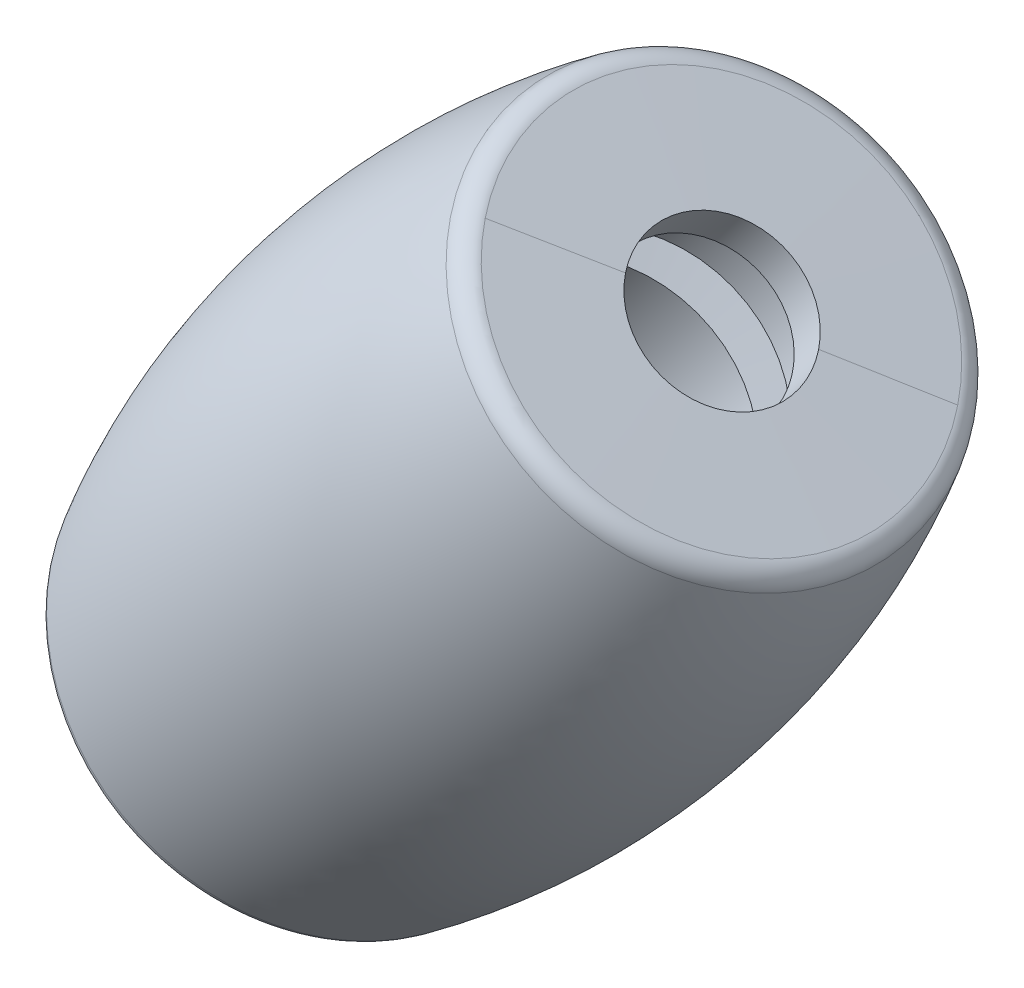
ISO-10303-21;
HEADER;
FILE_DESCRIPTION(('STEP AP214'),'2;1');
FILE_NAME('part.step','',(''),(''),'','','');
FILE_SCHEMA(('AUTOMOTIVE_DESIGN { 1 0 10303 214 1 1 1 1 }'));
ENDSEC;
DATA;
#1=APPLICATION_CONTEXT('core data for automotive mechanical design processes');
#2=APPLICATION_PROTOCOL_DEFINITION('international standard','automotive_design',2000,#1);
#3=PRODUCT_CONTEXT('',#1,'mechanical');
#4=PRODUCT('Part','Part','',(#3));
#5=PRODUCT_RELATED_PRODUCT_CATEGORY('part','',(#4));
#6=PRODUCT_DEFINITION_FORMATION('','',#4);
#7=PRODUCT_DEFINITION_CONTEXT('part definition',#1,'design');
#8=PRODUCT_DEFINITION('design','',#6,#7);
#9=PRODUCT_DEFINITION_SHAPE('','',#8);
#10=(LENGTH_UNIT() NAMED_UNIT(*) SI_UNIT(.MILLI.,.METRE.));
#11=(NAMED_UNIT(*) PLANE_ANGLE_UNIT() SI_UNIT($,.RADIAN.));
#12=(NAMED_UNIT(*) SI_UNIT($,.STERADIAN.) SOLID_ANGLE_UNIT());
#13=UNCERTAINTY_MEASURE_WITH_UNIT(LENGTH_MEASURE(1.E-05),#10,'distance_accuracy_value','');
#14=(GEOMETRIC_REPRESENTATION_CONTEXT(3) GLOBAL_UNCERTAINTY_ASSIGNED_CONTEXT((#13)) GLOBAL_UNIT_ASSIGNED_CONTEXT((#10,
#11,#12)) REPRESENTATION_CONTEXT('',''));
#15=CARTESIAN_POINT('',(0.,0.,0.));
#16=DIRECTION('',(0.,0.,1.));
#17=DIRECTION('',(1.,0.,0.));
#18=AXIS2_PLACEMENT_3D('',#15,#16,#17);
#19=CARTESIAN_POINT('',(-18.4522106782593,15.3546709858989,0.));
#20=DIRECTION('',(-0.623489801858733,-0.78183148246803,0.));
#21=DIRECTION('',(0.78183148246803,-0.623489801858733,0.));
#22=AXIS2_PLACEMENT_3D('',#19,#20,#21);
#23=CONICAL_SURFACE('',#22,4.5000000001542,1.4835298641937);
#24=CARTESIAN_POINT('',(-18.4522106783033,15.3546709858436,0.));
#25=DIRECTION('',(0.623489801858733,0.78183148246803,0.));
#26=DIRECTION('',(-0.78183148246803,0.623489801858733,0.));
#27=AXIS2_PLACEMENT_3D('',#24,#25,#26);
#28=CIRCLE('',#27,4.5);
#29=CARTESIAN_POINT('',(-21.9704523494095,18.1603750942079,0.));
#30=VERTEX_POINT('',#29);
#31=EDGE_CURVE('E21',#30,#30,#28,.F.);
#32=ORIENTED_EDGE('',*,*,#31,.T.);
#33=EDGE_LOOP('',(#32));
#34=FACE_BOUND('',#33,.T.);
#35=CARTESIAN_POINT('',(-18.3703882440733,15.457273073099,0.));
#36=DIRECTION('',(0.623489801858733,0.78183148246803,0.));
#37=DIRECTION('',(-0.78183148246803,0.623489801858733,0.));
#38=AXIS2_PLACEMENT_3D('',#35,#36,#37);
#39=CIRCLE('',#38,3.);
#40=CARTESIAN_POINT('',(-20.7158826914774,17.3277424786752,0.));
#41=VERTEX_POINT('',#40);
#42=EDGE_CURVE('E101',#41,#41,#39,.T.);
#43=ORIENTED_EDGE('',*,*,#42,.T.);
#44=EDGE_LOOP('',(#43));
#45=FACE_BOUND('',#44,.T.);
#46=ADVANCED_FACE('F17',(#34,#45),#23,.F.);
#47=CARTESIAN_POINT('',(-18.7639555792327,14.9637552446096,0.));
#48=DIRECTION('',(0.623489801858733,0.78183148246803,0.));
#49=DIRECTION('',(-0.78183148246803,0.623489801858733,0.));
#50=AXIS2_PLACEMENT_3D('',#47,#48,#49);
#51=CYLINDRICAL_SURFACE('',#50,4.5);
#52=CARTESIAN_POINT('',(-19.075700480154,14.5728395033857,0.));
#53=DIRECTION('',(0.623489801858733,0.78183148246803,0.));
#54=DIRECTION('',(0.585160399242417,-0.466649846623631,-0.663193205487358));
#55=AXIS2_PLACEMENT_3D('',#52,#53,#54);
#56=CIRCLE('',#55,4.49999999995989);
#57=CARTESIAN_POINT('',(-16.4424786835866,12.4729151935981,-2.98436942466651));
#58=VERTEX_POINT('',#57);
#59=EDGE_CURVE('E99',#58,#58,#56,.F.);
#60=ORIENTED_EDGE('',*,*,#59,.T.);
#61=EDGE_LOOP('',(#60));
#62=FACE_BOUND('',#61,.T.);
#63=ORIENTED_EDGE('',*,*,#31,.F.);
#64=EDGE_LOOP('',(#63));
#65=FACE_BOUND('',#64,.T.);
#66=ADVANCED_FACE('F109',(#62,#65),#51,.F.);
#67=CARTESIAN_POINT('',(-17.4858014854223,16.5665097836691,0.));
#68=DIRECTION('',(0.623489801858733,0.78183148246803,0.));
#69=DIRECTION('',(-0.78183148246803,0.623489801858733,0.));
#70=AXIS2_PLACEMENT_3D('',#67,#68,#69);
#71=CYLINDRICAL_SURFACE('',#70,3.);
#72=ORIENTED_EDGE('',*,*,#42,.F.);
#73=EDGE_LOOP('',(#72));
#74=FACE_BOUND('',#73,.T.);
#75=CARTESIAN_POINT('',(-16.6012147267927,17.6757464942122,0.));
#76=DIRECTION('',(0.623489801858733,0.78183148246803,0.));
#77=DIRECTION('',(0.58516039925179,-0.466649846631107,-0.663193205473827));
#78=AXIS2_PLACEMENT_3D('',#75,#76,#77);
#79=CIRCLE('',#78,3.00000000006303);
#80=CARTESIAN_POINT('',(-14.8457335290004,16.2757969542895,-1.98957961646329));
#81=VERTEX_POINT('',#80);
#82=EDGE_CURVE('E96',#81,#81,#79,.T.);
#83=ORIENTED_EDGE('',*,*,#82,.T.);
#84=EDGE_LOOP('',(#83));
#85=FACE_BOUND('',#84,.T.);
#86=ADVANCED_FACE('F111',(#74,#85),#71,.F.);
#87=CARTESIAN_POINT('',(-19.0757004801596,14.5728395033786,0.));
#88=DIRECTION('',(0.623489801858733,0.78183148246803,0.));
#89=DIRECTION('',(-0.78183148246803,0.623489801858733,0.));
#90=AXIS2_PLACEMENT_3D('',#87,#88,#89);
#91=CONICAL_SURFACE('',#90,4.50000000005737,1.48352986422129);
#92=ORIENTED_EDGE('',*,*,#59,.F.);
#93=EDGE_LOOP('',(#92));
#94=FACE_BOUND('',#93,.T.);
#95=CARTESIAN_POINT('',(-19.1575229143921,14.4702374161202,0.));
#96=DIRECTION('',(0.623489801858733,0.78183148246803,0.));
#97=DIRECTION('',(-0.78183148246803,0.623489801858733,0.));
#98=AXIS2_PLACEMENT_3D('',#95,#96,#97);
#99=CIRCLE('',#98,3.);
#100=CARTESIAN_POINT('',(-21.5030173617962,16.3407068216964,0.));
#101=VERTEX_POINT('',#100);
#102=EDGE_CURVE('E93',#101,#101,#99,.F.);
#103=ORIENTED_EDGE('',*,*,#102,.T.);
#104=EDGE_LOOP('',(#103));
#105=FACE_BOUND('',#104,.T.);
#106=ADVANCED_FACE('F119',(#94,#105),#91,.F.);
#107=CARTESIAN_POINT('',(-16.5193922925809,17.7783485814447,0.));
#108=DIRECTION('',(0.623489801858733,0.78183148246803,0.));
#109=DIRECTION('',(-0.78183148246803,0.623489801858733,0.));
#110=AXIS2_PLACEMENT_3D('',#107,#108,#109);
#111=CONICAL_SURFACE('',#110,4.49999999997896,1.48352986421136);
#112=CARTESIAN_POINT('',(-16.5193922925413,17.7783485814945,0.));
#113=DIRECTION('',(0.623489801858733,0.78183148246803,0.));
#114=DIRECTION('',(-0.78183148246803,0.623489801858733,0.));
#115=AXIS2_PLACEMENT_3D('',#112,#113,#114);
#116=CIRCLE('',#115,4.5);
#117=CARTESIAN_POINT('',(-20.0376339636474,20.5840526898588,0.));
#118=VERTEX_POINT('',#117);
#119=EDGE_CURVE('E77',#118,#118,#116,.T.);
#120=ORIENTED_EDGE('',*,*,#119,.T.);
#121=EDGE_LOOP('',(#120));
#122=FACE_BOUND('',#121,.T.);
#123=ORIENTED_EDGE('',*,*,#82,.F.);
#124=EDGE_LOOP('',(#123));
#125=FACE_BOUND('',#124,.T.);
#126=ADVANCED_FACE('F231',(#122,#125),#111,.F.);
#127=CARTESIAN_POINT('',(-20.0421096730431,13.3610007055501,0.));
#128=DIRECTION('',(0.623489801858733,0.78183148246803,0.));
#129=DIRECTION('',(-0.78183148246803,0.623489801858733,0.));
#130=AXIS2_PLACEMENT_3D('',#127,#128,#129);
#131=CYLINDRICAL_SURFACE('',#130,3.);
#132=ORIENTED_EDGE('',*,*,#102,.F.);
#133=EDGE_LOOP('',(#132));
#134=FACE_BOUND('',#133,.T.);
#135=CARTESIAN_POINT('',(-20.9266964317206,12.251763994947,0.));
#136=DIRECTION('',(-0.623489801858733,-0.78183148246803,0.));
#137=DIRECTION('',(-0.585160399236117,0.466649846618608,0.66319320549645));
#138=AXIS2_PLACEMENT_3D('',#135,#136,#137);
#139=CIRCLE('',#138,2.9999999999607);
#140=CARTESIAN_POINT('',(-19.1712152339766,10.8518144550893,-1.98957961642698));
#141=VERTEX_POINT('',#140);
#142=CARTESIAN_POINT('',(-22.6821776295252,13.6517135348805,1.98957961657116));
#143=VERTEX_POINT('',#142);
#144=EDGE_CURVE('E70',#141,#143,#139,.T.);
#145=ORIENTED_EDGE('',*,*,#144,.T.);
#146=CARTESIAN_POINT('',(-20.9266964317206,12.251763994947,0.));
#147=DIRECTION('',(-0.623489801858733,-0.78183148246803,0.));
#148=DIRECTION('',(-0.585160399236117,0.466649846618608,0.66319320549645));
#149=AXIS2_PLACEMENT_3D('',#146,#147,#148);
#150=CIRCLE('',#149,2.9999999999607);
#151=EDGE_CURVE('E68',#143,#141,#150,.T.);
#152=ORIENTED_EDGE('',*,*,#151,.T.);
#153=EDGE_LOOP('',(#145,#152));
#154=FACE_BOUND('',#153,.T.);
#155=ADVANCED_FACE('F71',(#134,#154),#131,.F.);
#156=CARTESIAN_POINT('',(-16.2076473916119,18.1692643227285,0.));
#157=DIRECTION('',(0.623489801858733,0.78183148246803,0.));
#158=DIRECTION('',(-0.78183148246803,0.623489801858733,0.));
#159=AXIS2_PLACEMENT_3D('',#156,#157,#158);
#160=CYLINDRICAL_SURFACE('',#159,4.5);
#161=CARTESIAN_POINT('',(-15.8959024906918,18.5601800639509,0.));
#162=DIRECTION('',(-0.623489801858733,-0.78183148246803,0.));
#163=DIRECTION('',(-0.585160399250354,0.466649846629961,0.663193205475901));
#164=AXIS2_PLACEMENT_3D('',#161,#162,#163);
#165=CIRCLE('',#164,4.50000000003765);
#166=CARTESIAN_POINT('',(-18.5291242873404,20.6601043738033,2.98436942466651));
#167=VERTEX_POINT('',#166);
#168=EDGE_CURVE('E210',#167,#167,#165,.F.);
#169=ORIENTED_EDGE('',*,*,#168,.T.);
#170=EDGE_LOOP('',(#169));
#171=FACE_BOUND('',#170,.T.);
#172=ORIENTED_EDGE('',*,*,#119,.F.);
#173=EDGE_LOOP('',(#172));
#174=FACE_BOUND('',#173,.T.);
#175=ADVANCED_FACE('F225',(#171,#174),#160,.F.);
#176=CARTESIAN_POINT('',(-21.0085188659488,12.1491619076938,0.));
#177=DIRECTION('',(-0.623489801858733,-0.78183148246803,0.));
#178=DIRECTION('',(0.78183148246803,-0.623489801858733,0.));
#179=AXIS2_PLACEMENT_3D('',#176,#177,#178);
#180=CONICAL_SURFACE('',#179,4.50000000000739,1.48352986418043);
#181=CARTESIAN_POINT('',(-19.1712152340011,10.8518144550822,-1.98957961641394));
#182=CARTESIAN_POINT('',(-19.1380519771208,10.8183737526768,-2.03102919177293));
#183=CARTESIAN_POINT('',(-19.1048887202494,10.7849330502782,-2.07247876714446));
#184=CARTESIAN_POINT('',(-19.0385622065336,10.7180516455136,-2.15537791784968));
#185=CARTESIAN_POINT('',(-19.0053989496892,10.6846109431476,-2.19682749318337));
#186=CARTESIAN_POINT('',(-18.939072435966,10.617729538397,-2.27972664383784));
#187=CARTESIAN_POINT('',(-18.9059091790873,10.5842888360123,-2.32117621915863));
#188=CARTESIAN_POINT('',(-18.8395826653652,10.5174074312614,-2.40407536981368));
#189=CARTESIAN_POINT('',(-18.8064194085218,10.4839667288952,-2.44552494514795));
#190=CARTESIAN_POINT('',(-18.7400928948034,10.4170853241319,-2.52842409585208));
#191=CARTESIAN_POINT('',(-18.7069296379285,10.3836446217347,-2.56987367122195));
#192=CARTESIAN_POINT('',(-18.6406031242022,10.3167632169442,-2.65277282191615));
#193=CARTESIAN_POINT('',(-18.6074398673509,10.2833225145508,-2.69422239724048));
#194=CARTESIAN_POINT('',(-18.5411133536507,10.2164411097942,-2.77712154789709));
#195=CARTESIAN_POINT('',(-18.5079500968018,10.183000407431,-2.81857112322938));
#196=CARTESIAN_POINT('',(-18.4416235830771,10.1161190026719,-2.90147027393191));
#197=CARTESIAN_POINT('',(-18.4084603262014,10.0826783002759,-2.94291984930215));
#198=CARTESIAN_POINT('',(-18.3752970693307,10.0492375978657,-2.98436942466491));
#199=B_SPLINE_CURVE_WITH_KNOTS('',3,(#181,#182,#183,#184,#185,#186,#187,#188,#189,#190,#191,
#192,#193,#194,#195,#196,#197,#198),.UNSPECIFIED.,.F.,.F.,(4,2,2,2,2,2,2,2,4),(0.,
0.188216219639607,0.3764324391091,0.564648658637371,0.752864878106864,0.941081097746466,
1.12929731725219,1.31751353672168,1.50572975636128),.UNSPECIFIED.);
#200=CARTESIAN_POINT('',(-18.3752970693256,10.0492375978743,-2.98436942466369));
#201=VERTEX_POINT('',#200);
#202=EDGE_CURVE('E84',#141,#201,#199,.T.);
#203=ORIENTED_EDGE('',*,*,#202,.T.);
#204=CARTESIAN_POINT('',(-21.0085188659241,12.1491619077247,0.));
#205=DIRECTION('',(0.623489801858733,0.78183148246803,0.));
#206=DIRECTION('',(-0.78183148246803,0.623489801858733,0.));
#207=AXIS2_PLACEMENT_3D('',#204,#205,#206);
#208=CIRCLE('',#207,4.5);
#209=CARTESIAN_POINT('',(-23.6417406625634,14.2490862175312,2.98436942473594));
#210=VERTEX_POINT('',#209);
#211=EDGE_CURVE('E87',#201,#210,#208,.F.);
#212=ORIENTED_EDGE('',*,*,#211,.T.);
#213=DIRECTION('',(0.637274404039492,-0.396732999518862,-0.660669555109721));
#214=VECTOR('',#213,1.);
#215=CARTESIAN_POINT('',(-481350.537000196,299662.660657417,499000.));
#216=LINE('',#215,#214);
#217=EDGE_CURVE('E76',#210,#143,#216,.T.);
#218=ORIENTED_EDGE('',*,*,#217,.T.);
#219=ORIENTED_EDGE('',*,*,#144,.F.);
#220=EDGE_LOOP('',(#203,#212,#218,#219));
#221=FACE_BOUND('',#220,.T.);
#222=ADVANCED_FACE('F86',(#221),#180,.F.);
#223=CARTESIAN_POINT('',(-21.0085188659376,12.1491619077078,0.));
#224=DIRECTION('',(-0.623489801858733,-0.78183148246803,0.));
#225=DIRECTION('',(0.78183148246803,-0.623489801858733,0.));
#226=AXIS2_PLACEMENT_3D('',#223,#224,#225);
#227=CONICAL_SURFACE('',#226,4.50000000020236,1.48352986420362);
#228=ORIENTED_EDGE('',*,*,#151,.F.);
#229=ORIENTED_EDGE('',*,*,#217,.F.);
#230=CARTESIAN_POINT('',(-21.0085188659241,12.1491619077247,0.));
#231=DIRECTION('',(0.623489801858733,0.78183148246803,0.));
#232=DIRECTION('',(-0.78183148246803,0.623489801858733,0.));
#233=AXIS2_PLACEMENT_3D('',#230,#231,#232);
#234=CIRCLE('',#233,4.5);
#235=EDGE_CURVE('E207',#210,#201,#234,.F.);
#236=ORIENTED_EDGE('',*,*,#235,.T.);
#237=ORIENTED_EDGE('',*,*,#202,.F.);
#238=EDGE_LOOP('',(#228,#229,#236,#237));
#239=FACE_BOUND('',#238,.T.);
#240=ADVANCED_FACE('F81',(#239),#227,.F.);
#241=CARTESIAN_POINT('',(-15.8959024906862,18.5601800639579,0.));
#242=DIRECTION('',(-0.623489801858733,-0.78183148246803,0.));
#243=DIRECTION('',(0.78183148246803,-0.623489801858733,0.));
#244=AXIS2_PLACEMENT_3D('',#241,#242,#243);
#245=CONICAL_SURFACE('',#244,4.50000000013513,1.48352986420362);
#246=ORIENTED_EDGE('',*,*,#168,.F.);
#247=EDGE_LOOP('',(#246));
#248=FACE_BOUND('',#247,.T.);
#249=CARTESIAN_POINT('',(-15.8140800564525,18.662782151218,0.));
#250=DIRECTION('',(0.623489801858733,0.78183148246803,0.));
#251=DIRECTION('',(-0.78183148246803,0.623489801858733,0.));
#252=AXIS2_PLACEMENT_3D('',#249,#250,#251);
#253=CIRCLE('',#252,3.);
#254=CARTESIAN_POINT('',(-18.1595745038566,20.5332515567942,0.));
#255=VERTEX_POINT('',#254);
#256=EDGE_CURVE('E204',#255,#255,#253,.T.);
#257=ORIENTED_EDGE('',*,*,#256,.T.);
#258=EDGE_LOOP('',(#257));
#259=FACE_BOUND('',#258,.T.);
#260=ADVANCED_FACE('F219',(#248,#259),#245,.F.);
#261=CARTESIAN_POINT('',(-21.3202637668535,11.7582461664907,0.));
#262=DIRECTION('',(0.623489801858733,0.78183148246803,0.));
#263=DIRECTION('',(-0.78183148246803,0.623489801858733,0.));
#264=AXIS2_PLACEMENT_3D('',#261,#262,#263);
#265=CYLINDRICAL_SURFACE('',#264,4.5);
#266=CARTESIAN_POINT('',(-21.6320086677604,11.3673304252848,0.));
#267=DIRECTION('',(0.623489801858733,0.78183148246803,0.));
#268=DIRECTION('',(0.585160399249281,-0.466649846629105,-0.66319320547745));
#269=AXIS2_PLACEMENT_3D('',#266,#267,#268);
#270=CIRCLE('',#269,4.50000000002713);
#271=CARTESIAN_POINT('',(-18.9987868711228,9.26740611544119,-2.98436942466651));
#272=VERTEX_POINT('',#271);
#273=EDGE_CURVE('E201',#272,#272,#270,.F.);
#274=ORIENTED_EDGE('',*,*,#273,.T.);
#275=EDGE_LOOP('',(#274));
#276=FACE_BOUND('',#275,.T.);
#277=ORIENTED_EDGE('',*,*,#211,.F.);
#278=ORIENTED_EDGE('',*,*,#235,.F.);
#279=EDGE_LOOP('',(#277,#278));
#280=FACE_BOUND('',#279,.T.);
#281=ADVANCED_FACE('F273',(#276,#280),#265,.F.);
#282=CARTESIAN_POINT('',(-15.3637952100659,19.2274214892373,0.));
#283=DIRECTION('',(0.623489801858733,0.78183148246803,0.));
#284=DIRECTION('',(-0.78183148246803,0.623489801858733,0.));
#285=AXIS2_PLACEMENT_3D('',#282,#283,#284);
#286=CYLINDRICAL_SURFACE('',#285,3.);
#287=ORIENTED_EDGE('',*,*,#256,.F.);
#288=EDGE_LOOP('',(#287));
#289=FACE_BOUND('',#288,.T.);
#290=CARTESIAN_POINT('',(-14.9135103637034,19.7920608272265,0.));
#291=DIRECTION('',(0.623489801858733,0.78183148246803,0.));
#292=DIRECTION('',(0.585160399247144,-0.466649846627402,-0.663193205480534));
#293=AXIS2_PLACEMENT_3D('',#290,#291,#292);
#294=CIRCLE('',#293,2.99999999994697);
#295=CARTESIAN_POINT('',(-13.158029165993,18.3921112873691,-1.98957961640644));
#296=VERTEX_POINT('',#295);
#297=EDGE_CURVE('E198',#296,#296,#294,.T.);
#298=ORIENTED_EDGE('',*,*,#297,.T.);
#299=EDGE_LOOP('',(#298));
#300=FACE_BOUND('',#299,.T.);
#301=ADVANCED_FACE('F280',(#289,#300),#286,.F.);
#302=CARTESIAN_POINT('',(-21.632008667766,11.3673304252778,0.));
#303=DIRECTION('',(0.623489801858733,0.78183148246803,0.));
#304=DIRECTION('',(-0.78183148246803,0.623489801858733,0.));
#305=AXIS2_PLACEMENT_3D('',#302,#303,#304);
#306=CONICAL_SURFACE('',#305,4.50000000012462,1.48352986420362);
#307=ORIENTED_EDGE('',*,*,#273,.F.);
#308=EDGE_LOOP('',(#307));
#309=FACE_BOUND('',#308,.T.);
#310=CARTESIAN_POINT('',(-21.7138311020129,11.2647283380012,0.));
#311=DIRECTION('',(0.623489801858733,0.78183148246803,0.));
#312=DIRECTION('',(-0.78183148246803,0.623489801858733,0.));
#313=AXIS2_PLACEMENT_3D('',#310,#311,#312);
#314=CIRCLE('',#313,3.);
#315=CARTESIAN_POINT('',(-24.059325549417,13.1351977435774,0.));
#316=VERTEX_POINT('',#315);
#317=EDGE_CURVE('E195',#316,#316,#314,.F.);
#318=ORIENTED_EDGE('',*,*,#317,.T.);
#319=EDGE_LOOP('',(#318));
#320=FACE_BOUND('',#319,.T.);
#321=ADVANCED_FACE('F287',(#309,#320),#306,.F.);
#322=CARTESIAN_POINT('',(-14.8671443176208,19.8502020100283,0.));
#323=DIRECTION('',(0.623489801858733,0.78183148246803,0.));
#324=DIRECTION('',(-0.78183148246803,0.623489801858733,0.));
#325=AXIS2_PLACEMENT_3D('',#322,#323,#324);
#326=CONICAL_SURFACE('',#325,3.85000000049085,1.48352986426301);
#327=CARTESIAN_POINT('',(-14.8671443176156,19.8502020100348,0.));
#328=DIRECTION('',(0.623489801858733,0.78183148246803,0.));
#329=DIRECTION('',(-0.78183148246803,0.623489801858733,0.));
#330=AXIS2_PLACEMENT_3D('',#327,#328,#329);
#331=CIRCLE('',#330,3.85);
#332=CARTESIAN_POINT('',(-17.8771955251175,22.2506377471909,0.));
#333=VERTEX_POINT('',#332);
#334=EDGE_CURVE('E192',#333,#333,#331,.T.);
#335=ORIENTED_EDGE('',*,*,#334,.T.);
#336=EDGE_LOOP('',(#335));
#337=FACE_BOUND('',#336,.T.);
#338=ORIENTED_EDGE('',*,*,#297,.F.);
#339=EDGE_LOOP('',(#338));
#340=FACE_BOUND('',#339,.T.);
#341=ADVANCED_FACE('F295',(#337,#340),#326,.F.);
#342=CARTESIAN_POINT('',(-22.1641159483995,10.7000889999819,0.));
#343=DIRECTION('',(0.623489801858733,0.78183148246803,0.));
#344=DIRECTION('',(-0.78183148246803,0.623489801858733,0.));
#345=AXIS2_PLACEMENT_3D('',#342,#343,#344);
#346=CYLINDRICAL_SURFACE('',#345,3.);
#347=ORIENTED_EDGE('',*,*,#317,.F.);
#348=EDGE_LOOP('',(#347));
#349=FACE_BOUND('',#348,.T.);
#350=CARTESIAN_POINT('',(-22.6144007947987,10.1354496619467,0.));
#351=DIRECTION('',(-0.623489801858733,-0.78183148246803,0.));
#352=DIRECTION('',(-0.585160399249785,0.466649846629508,0.663193205476722));
#353=AXIS2_PLACEMENT_3D('',#350,#351,#352);
#354=CIRCLE('',#353,2.99999999996422);
#355=CARTESIAN_POINT('',(-24.3698819925271,11.5353992018186,1.98957961640645));
#356=VERTEX_POINT('',#355);
#357=EDGE_CURVE('E189',#356,#356,#354,.T.);
#358=ORIENTED_EDGE('',*,*,#357,.T.);
#359=EDGE_LOOP('',(#358));
#360=FACE_BOUND('',#359,.T.);
#361=ADVANCED_FACE('F303',(#349,#360),#346,.F.);
#362=CARTESIAN_POINT('',(-14.5779240808966,20.2128727157299,0.));
#363=DIRECTION('',(0.623489801858733,0.78183148246803,0.));
#364=DIRECTION('',(-0.78183148246803,0.623489801858733,0.));
#365=AXIS2_PLACEMENT_3D('',#362,#363,#364);
#366=CYLINDRICAL_SURFACE('',#365,3.85);
#367=CARTESIAN_POINT('',(-14.288703844157,20.5755434214507,0.));
#368=DIRECTION('',(-0.623489801858733,-0.78183148246803,0.));
#369=DIRECTION('',(-0.585160399244819,0.466649846625547,0.663193205483891));
#370=AXIS2_PLACEMENT_3D('',#367,#368,#369);
#371=CIRCLE('',#370,3.85000000000679);
#372=CARTESIAN_POINT('',(-16.5415713812536,22.3721453309622,2.55329384111747));
#373=VERTEX_POINT('',#372);
#374=EDGE_CURVE('E186',#373,#373,#371,.F.);
#375=ORIENTED_EDGE('',*,*,#374,.T.);
#376=EDGE_LOOP('',(#375));
#377=FACE_BOUND('',#376,.T.);
#378=ORIENTED_EDGE('',*,*,#334,.F.);
#379=EDGE_LOOP('',(#378));
#380=FACE_BOUND('',#379,.T.);
#381=ADVANCED_FACE('F311',(#377,#380),#366,.F.);
#382=CARTESIAN_POINT('',(-22.6607668408539,10.0773084791792,0.));
#383=DIRECTION('',(-0.623489801858733,-0.78183148246803,0.));
#384=DIRECTION('',(0.78183148246803,-0.623489801858733,0.));
#385=AXIS2_PLACEMENT_3D('',#382,#383,#384);
#386=CONICAL_SURFACE('',#385,3.85000000003602,1.48352986421828);
#387=CARTESIAN_POINT('',(-22.6607668408498,10.0773084791844,0.));
#388=DIRECTION('',(0.623489801858733,0.78183148246803,0.));
#389=DIRECTION('',(-0.78183148246803,0.623489801858733,0.));
#390=AXIS2_PLACEMENT_3D('',#387,#388,#389);
#391=CIRCLE('',#390,3.85000000000001);
#392=CARTESIAN_POINT('',(-25.6708180483517,12.4777442163405,0.));
#393=VERTEX_POINT('',#392);
#394=EDGE_CURVE('E183',#393,#393,#391,.F.);
#395=ORIENTED_EDGE('',*,*,#394,.T.);
#396=EDGE_LOOP('',(#395));
#397=FACE_BOUND('',#396,.T.);
#398=ORIENTED_EDGE('',*,*,#357,.F.);
#399=EDGE_LOOP('',(#398));
#400=FACE_BOUND('',#399,.T.);
#401=ADVANCED_FACE('F319',(#397,#400),#386,.F.);
#402=CARTESIAN_POINT('',(-14.2887038442163,20.5755434213763,0.));
#403=DIRECTION('',(-0.623489801858733,-0.78183148246803,0.));
#404=DIRECTION('',(0.78183148246803,-0.623489801858733,0.));
#405=AXIS2_PLACEMENT_3D('',#402,#403,#404);
#406=CONICAL_SURFACE('',#405,3.8500000098902,1.56206968055094);
#407=ORIENTED_EDGE('',*,*,#374,.F.);
#408=EDGE_LOOP('',(#407));
#409=FACE_BOUND('',#408,.T.);
#410=CARTESIAN_POINT('',(-14.2778216180382,20.5891893013892,0.));
#411=DIRECTION('',(0.623489801858733,0.78183148246803,0.));
#412=DIRECTION('',(-0.78183148246803,0.623489801858733,0.));
#413=AXIS2_PLACEMENT_3D('',#410,#411,#412);
#414=CIRCLE('',#413,1.85);
#415=CARTESIAN_POINT('',(-15.724209860604,21.7426454348279,0.));
#416=VERTEX_POINT('',#415);
#417=EDGE_CURVE('E180',#416,#416,#414,.T.);
#418=ORIENTED_EDGE('',*,*,#417,.T.);
#419=EDGE_LOOP('',(#418));
#420=FACE_BOUND('',#419,.T.);
#421=ADVANCED_FACE('F327',(#409,#420),#406,.F.);
#422=CARTESIAN_POINT('',(-23.1751459273832,9.43229750614829,0.));
#423=DIRECTION('',(0.623489801858733,0.78183148246803,0.));
#424=DIRECTION('',(-0.78183148246803,0.623489801858733,0.));
#425=AXIS2_PLACEMENT_3D('',#422,#423,#424);
#426=CYLINDRICAL_SURFACE('',#425,3.85000000000001);
#427=ORIENTED_EDGE('',*,*,#394,.F.);
#428=EDGE_LOOP('',(#427));
#429=FACE_BOUND('',#428,.T.);
#430=CARTESIAN_POINT('',(-23.6895250139086,8.78728653312228,0.));
#431=DIRECTION('',(0.623489801858733,0.78183148246803,0.));
#432=DIRECTION('',(0.585160399248065,-0.466649846628136,-0.663193205479204));
#433=AXIS2_PLACEMENT_3D('',#430,#431,#432);
#434=CIRCLE('',#433,3.85000000003399);
#435=CARTESIAN_POINT('',(-25.942392549604,10.5838884415272,2.55329383953035));
#436=VERTEX_POINT('',#435);
#437=CARTESIAN_POINT('',(-21.4366574797976,6.99068462594709,-2.55329383770199));
#438=VERTEX_POINT('',#437);
#439=EDGE_CURVE('E178',#436,#438,#434,.T.);
#440=ORIENTED_EDGE('',*,*,#439,.F.);
#441=CARTESIAN_POINT('',(-23.6895250139086,8.78728653312228,0.));
#442=DIRECTION('',(0.623489801858733,0.78183148246803,0.));
#443=DIRECTION('',(0.585160399248065,-0.466649846628136,-0.663193205479204));
#444=AXIS2_PLACEMENT_3D('',#441,#442,#443);
#445=CIRCLE('',#444,3.85000000003399);
#446=EDGE_CURVE('E158',#438,#436,#445,.T.);
#447=ORIENTED_EDGE('',*,*,#446,.F.);
#448=EDGE_LOOP('',(#440,#447));
#449=FACE_BOUND('',#448,.T.);
#450=ADVANCED_FACE('F335',(#429,#449),#426,.F.);
#451=CARTESIAN_POINT('',(-13.9660767171088,20.9801050426233,0.));
#452=DIRECTION('',(0.623489801858733,0.78183148246803,0.));
#453=DIRECTION('',(-0.78183148246803,0.623489801858733,0.));
#454=AXIS2_PLACEMENT_3D('',#451,#452,#453);
#455=CYLINDRICAL_SURFACE('',#454,1.85);
#456=ORIENTED_EDGE('',*,*,#417,.F.);
#457=EDGE_LOOP('',(#456));
#458=FACE_BOUND('',#457,.T.);
#459=CARTESIAN_POINT('',(-13.6543318161765,21.3710207838609,0.));
#460=DIRECTION('',(-0.623489801858733,-0.78183148246803,0.));
#461=DIRECTION('',(-0.585160399254279,0.466649846633092,0.663193205470235));
#462=AXIS2_PLACEMENT_3D('',#459,#460,#461);
#463=CIRCLE('',#462,1.85000000000464);
#464=CARTESIAN_POINT('',(-12.5717850775711,20.5077185675938,-1.22690743013956));
#465=VERTEX_POINT('',#464);
#466=CARTESIAN_POINT('',(-14.7368785540214,22.2343229995144,1.22690742925987));
#467=VERTEX_POINT('',#466);
#468=EDGE_CURVE('E174',#465,#467,#463,.T.);
#469=ORIENTED_EDGE('',*,*,#468,.F.);
#470=CARTESIAN_POINT('',(-13.6543318161765,21.3710207838609,0.));
#471=DIRECTION('',(-0.623489801858733,-0.78183148246803,0.));
#472=DIRECTION('',(-0.585160399254279,0.466649846633092,0.663193205470235));
#473=AXIS2_PLACEMENT_3D('',#470,#471,#472);
#474=CIRCLE('',#473,1.85000000000464);
#475=EDGE_CURVE('E151',#467,#465,#474,.T.);
#476=ORIENTED_EDGE('',*,*,#475,.F.);
#477=EDGE_LOOP('',(#469,#476));
#478=FACE_BOUND('',#477,.T.);
#479=ADVANCED_FACE('F343',(#458,#478),#455,.F.);
#480=CARTESIAN_POINT('',(-23.6858448848888,8.79190126895068,0.));
#481=DIRECTION('',(0.623489801858733,0.78183148246803,0.));
#482=DIRECTION('',(-0.78183148246803,0.623489801858733,0.));
#483=AXIS2_PLACEMENT_3D('',#480,#481,#482);
#484=CONICAL_SURFACE('',#483,4.52635591752648,1.56206968055436);
#485=DIRECTION('',(-0.590579024017981,0.459809397850188,0.663167953114907));
#486=VECTOR('',#485,1.);
#487=CARTESIAN_POINT('',(444356.829329278,-345974.3167972,-499000.));
#488=LINE('',#487,#486);
#489=CARTESIAN_POINT('',(-21.0372006499492,6.6796779749379,-3.00184848910845));
#490=VERTEX_POINT('',#489);
#491=EDGE_CURVE('E170',#490,#438,#488,.T.);
#492=ORIENTED_EDGE('',*,*,#491,.F.);
#493=CARTESIAN_POINT('',(-23.6858448849164,8.79190126891595,0.));
#494=DIRECTION('',(0.623489801858733,0.78183148246803,0.));
#495=DIRECTION('',(-0.585160399247512,0.466649846627695,0.663193205480002));
#496=AXIS2_PLACEMENT_3D('',#493,#494,#495);
#497=CIRCLE('',#496,4.52635591341353);
#498=CARTESIAN_POINT('',(-26.3344891172301,10.9041245608127,3.00184848613128));
#499=VERTEX_POINT('',#498);
#500=EDGE_CURVE('E149',#499,#490,#497,.T.);
#501=ORIENTED_EDGE('',*,*,#500,.F.);
#502=DIRECTION('',(0.579697212246601,-0.473454758212275,-0.663167953115706));
#503=VECTOR('',#502,1.);
#504=CARTESIAN_POINT('',(-436216.242926586,356259.275293275,499000.000000601));
#505=LINE('',#504,#503);
#506=EDGE_CURVE('E171',#436,#499,#505,.F.);
#507=ORIENTED_EDGE('',*,*,#506,.F.);
#508=ORIENTED_EDGE('',*,*,#439,.T.);
#509=EDGE_LOOP('',(#492,#501,#507,#508));
#510=FACE_BOUND('',#509,.T.);
#511=ADVANCED_FACE('F351',(#510),#484,.T.);
#512=CARTESIAN_POINT('',(-13.6688941713107,21.3527601680997,0.));
#513=DIRECTION('',(-0.623489801858733,-0.78183148246803,0.));
#514=DIRECTION('',(0.78183148246803,-0.623489801858733,0.));
#515=AXIS2_PLACEMENT_3D('',#512,#513,#514);
#516=CONICAL_SURFACE('',#515,4.52635591382275,1.56206968053952);
#517=DIRECTION('',(0.590579024018152,-0.459809397849971,-0.663167953114906));
#518=VECTOR('',#517,1.);
#519=CARTESIAN_POINT('',(-444394.184068463,346004.461458474,499000.));
#520=LINE('',#519,#518);
#521=CARTESIAN_POINT('',(-16.3175384052992,23.4649834612894,3.0018484879744));
#522=VERTEX_POINT('',#521);
#523=EDGE_CURVE('E157',#522,#467,#520,.T.);
#524=ORIENTED_EDGE('',*,*,#523,.F.);
#525=CARTESIAN_POINT('',(-13.6688941713221,21.3527601680854,0.));
#526=DIRECTION('',(-0.623489801858733,-0.78183148246803,0.));
#527=DIRECTION('',(-0.585160399247512,0.466649846627695,0.663193205480002));
#528=AXIS2_PLACEMENT_3D('',#525,#526,#527);
#529=CIRCLE('',#528,4.52635591396768);
#530=CARTESIAN_POINT('',(-11.0202499375785,19.2405368750502,-3.00184848772052));
#531=VERTEX_POINT('',#530);
#532=EDGE_CURVE('E36',#531,#522,#529,.T.);
#533=ORIENTED_EDGE('',*,*,#532,.F.);
#534=CARTESIAN_POINT('',(-12.5717850775659,20.5077185675975,-1.2269074301411));
#535=CARTESIAN_POINT('',(-12.507137780077,20.4549193304499,-1.30086330756184));
#536=CARTESIAN_POINT('',(-12.4424904825906,20.4021200932669,-1.37481918495943));
#537=CARTESIAN_POINT('',(-12.3131958876133,20.2965216188823,-1.52273093973543));
#538=CARTESIAN_POINT('',(-12.2485485901224,20.2437223816807,-1.59668681711383));
#539=CARTESIAN_POINT('',(-12.1192539951132,20.1381239072996,-1.74459857189448));
#540=CARTESIAN_POINT('',(-12.0546066975948,20.0853246701202,-1.81855444929673));
#541=CARTESIAN_POINT('',(-11.9253121025912,19.9797261957406,-1.96646620410236));
#542=CARTESIAN_POINT('',(-11.8606648051061,19.9269269585405,-2.04042208150574));
#543=CARTESIAN_POINT('',(-11.7313702101316,19.8213284841677,-2.18833383629258));
#544=CARTESIAN_POINT('',(-11.6667229126422,19.7685292469949,-2.26228971367603));
#545=CARTESIAN_POINT('',(-11.5374283176112,19.6629307726216,-2.41020146847519));
#546=CARTESIAN_POINT('',(-11.4727810200695,19.6101315354209,-2.48415734589089));
#547=CARTESIAN_POINT('',(-11.3434864250393,19.5045330610241,-2.63206910070994));
#548=CARTESIAN_POINT('',(-11.2788391275509,19.451733823828,-2.70602497811328));
#549=CARTESIAN_POINT('',(-11.1495445325739,19.3461353494355,-2.85393673291973));
#550=CARTESIAN_POINT('',(-11.0848972350853,19.2933361122392,-2.92789261032283));
#551=CARTESIAN_POINT('',(-11.0202499375818,19.2405368750502,-3.00184848771821));
#552=B_SPLINE_CURVE_WITH_KNOTS('',3,(#534,#535,#536,#537,#538,#539,#540,#541,#542,#543,#544,
#545,#546,#547,#548,#549,#550,#551),.UNSPECIFIED.,.F.,.F.,(4,2,2,2,2,2,2,2,4),(0.,
0.334557228123265,0.669114456242404,1.00367168442538,1.33822891258221,1.67278614066778,
2.00734336894816,2.341900597105,2.67645782526183),.UNSPECIFIED.);
#553=EDGE_CURVE('E154',#465,#531,#552,.T.);
#554=ORIENTED_EDGE('',*,*,#553,.F.);
#555=ORIENTED_EDGE('',*,*,#468,.T.);
#556=EDGE_LOOP('',(#524,#533,#554,#555));
#557=FACE_BOUND('',#556,.T.);
#558=ADVANCED_FACE('F359',(#557),#516,.T.);
#559=CARTESIAN_POINT('',(-23.6858448848891,8.79190126895024,0.));
#560=DIRECTION('',(0.623489801858733,0.78183148246803,0.));
#561=DIRECTION('',(-0.78183148246803,0.623489801858733,0.));
#562=AXIS2_PLACEMENT_3D('',#559,#560,#561);
#563=CONICAL_SURFACE('',#562,4.52635591798738,1.56206968049211);
#564=ORIENTED_EDGE('',*,*,#491,.T.);
#565=ORIENTED_EDGE('',*,*,#446,.T.);
#566=ORIENTED_EDGE('',*,*,#506,.T.);
#567=CARTESIAN_POINT('',(-23.6858448849164,8.79190126891595,0.));
#568=DIRECTION('',(0.623489801858733,0.78183148246803,0.));
#569=DIRECTION('',(0.585160399247511,-0.466649846627695,-0.663193205480004));
#570=AXIS2_PLACEMENT_3D('',#567,#568,#569);
#571=CIRCLE('',#570,4.52635591341352);
#572=EDGE_CURVE('E145',#490,#499,#571,.T.);
#573=ORIENTED_EDGE('',*,*,#572,.F.);
#574=EDGE_LOOP('',(#564,#565,#566,#573));
#575=FACE_BOUND('',#574,.T.);
#576=ADVANCED_FACE('F367',(#575),#563,.T.);
#577=CARTESIAN_POINT('',(-13.6688941713195,21.3527601680887,0.));
#578=DIRECTION('',(-0.623489801858733,-0.78183148246803,0.));
#579=DIRECTION('',(0.78183148246803,-0.623489801858733,0.));
#580=AXIS2_PLACEMENT_3D('',#577,#578,#579);
#581=CONICAL_SURFACE('',#580,4.52635591700492,1.56206968055121);
#582=ORIENTED_EDGE('',*,*,#523,.T.);
#583=ORIENTED_EDGE('',*,*,#475,.T.);
#584=ORIENTED_EDGE('',*,*,#553,.T.);
#585=CARTESIAN_POINT('',(-13.6688941713221,21.3527601680854,0.));
#586=DIRECTION('',(-0.623489801858733,-0.78183148246803,0.));
#587=DIRECTION('',(0.585160399247512,-0.466649846627695,-0.663193205480003));
#588=AXIS2_PLACEMENT_3D('',#585,#586,#587);
#589=CIRCLE('',#588,4.52635591396768);
#590=EDGE_CURVE('E142',#522,#531,#589,.T.);
#591=ORIENTED_EDGE('',*,*,#590,.F.);
#592=EDGE_LOOP('',(#582,#583,#584,#591));
#593=FACE_BOUND('',#592,.T.);
#594=ADVANCED_FACE('F374',(#593),#581,.T.);
#595=CARTESIAN_POINT('',(-23.3741118542784,9.1828021252754,0.));
#596=DIRECTION('',(0.623489801858733,0.78183148246803,0.));
#597=DIRECTION('',(-0.78183148246803,0.623489801858733,0.));
#598=AXIS2_PLACEMENT_3D('',#595,#596,#597);
#599=TOROIDAL_SURFACE('',#598,4.52199264552199,0.500000000000002);
#600=CARTESIAN_POINT('',(-23.4537176564168,9.08297960674613,0.));
#601=DIRECTION('',(0.623489801858733,0.78183148246803,0.));
#602=DIRECTION('',(0.585160399247512,-0.466649846627694,-0.663193205480003));
#603=AXIS2_PLACEMENT_3D('',#600,#601,#602);
#604=CIRCLE('',#603,5.0054162496834);
#605=CARTESIAN_POINT('',(-20.524746285352,6.7472028815236,-3.31955804738923));
#606=VERTEX_POINT('',#605);
#607=EDGE_CURVE('E27',#606,#606,#604,.T.);
#608=ORIENTED_EDGE('',*,*,#607,.F.);
#609=EDGE_LOOP('',(#608));
#610=FACE_BOUND('',#609,.T.);
#611=ORIENTED_EDGE('',*,*,#572,.T.);
#612=ORIENTED_EDGE('',*,*,#500,.T.);
#613=EDGE_LOOP('',(#611,#612));
#614=FACE_BOUND('',#613,.T.);
#615=ADVANCED_FACE('F130',(#610,#614),#599,.T.);
#616=CARTESIAN_POINT('',(-13.9806272019571,20.9618593117297,0.));
#617=DIRECTION('',(0.623489801858733,0.78183148246803,0.));
#618=DIRECTION('',(-0.78183148246803,0.623489801858733,0.));
#619=AXIS2_PLACEMENT_3D('',#616,#617,#618);
#620=TOROIDAL_SURFACE('',#619,4.521992645522,0.5);
#621=ORIENTED_EDGE('',*,*,#532,.T.);
#622=ORIENTED_EDGE('',*,*,#590,.T.);
#623=EDGE_LOOP('',(#621,#622));
#624=FACE_BOUND('',#623,.T.);
#625=CARTESIAN_POINT('',(-13.9010213998188,21.061681830259,0.));
#626=DIRECTION('',(0.623489801858733,0.78183148246803,0.));
#627=DIRECTION('',(0.585160399247511,-0.466649846627695,-0.663193205480003));
#628=AXIS2_PLACEMENT_3D('',#625,#626,#627);
#629=CIRCLE('',#628,5.0054162496834);
#630=CARTESIAN_POINT('',(-10.9720500287541,18.7259051050365,-3.31955804738926));
#631=VERTEX_POINT('',#630);
#632=EDGE_CURVE('E11',#631,#631,#629,.F.);
#633=ORIENTED_EDGE('',*,*,#632,.F.);
#634=EDGE_LOOP('',(#633));
#635=FACE_BOUND('',#634,.T.);
#636=ADVANCED_FACE('F19',(#624,#635),#620,.T.);
#637=CARTESIAN_POINT('',(-32.7212191100581,26.2719270375673,15.9166369315202));
#638=DIRECTION('',(-0.518505327003157,0.413494200278784,-0.748448242836576));
#639=DIRECTION('',(0.585160399247512,-0.466649846627695,-0.663193205480003));
#640=AXIS2_PLACEMENT_3D('',#637,#638,#639);
#641=CIRCLE('',#640,30.0000000000002);
#642=TRIMMED_CURVE('',#641,(PARAMETER_VALUE(-0.643501108793283)),
(PARAMETER_VALUE(0.643501108793283)),.T.,.PARAMETER.);
#643=CARTESIAN_POINT('',(-18.6773695281178,15.0723307185026,0.));
#644=DIRECTION('',(0.623489801858733,0.78183148246803,0.));
#645=AXIS1_PLACEMENT('',#643,#644);
#646=SURFACE_OF_REVOLUTION('',#642,#645);
#647=ORIENTED_EDGE('',*,*,#632,.T.);
#648=EDGE_LOOP('',(#647));
#649=FACE_BOUND('',#648,.T.);
#650=ORIENTED_EDGE('',*,*,#607,.T.);
#651=EDGE_LOOP('',(#650));
#652=FACE_BOUND('',#651,.T.);
#653=ADVANCED_FACE('F123',(#649,#652),#646,.F.);
#654=CLOSED_SHELL('',(#46,#66,#86,#106,#126,#155,#175,#222,#240,#260,#281,#301,#321,#341,#361,
#381,#401,#421,#450,#479,#511,#558,#576,#594,#615,#636,#653));
#655=MANIFOLD_SOLID_BREP('B1',#654);
#656=ADVANCED_BREP_SHAPE_REPRESENTATION('',(#18,#655),#14);
#657=SHAPE_DEFINITION_REPRESENTATION(#9,#656);
ENDSEC;
END-ISO-10303-21;
